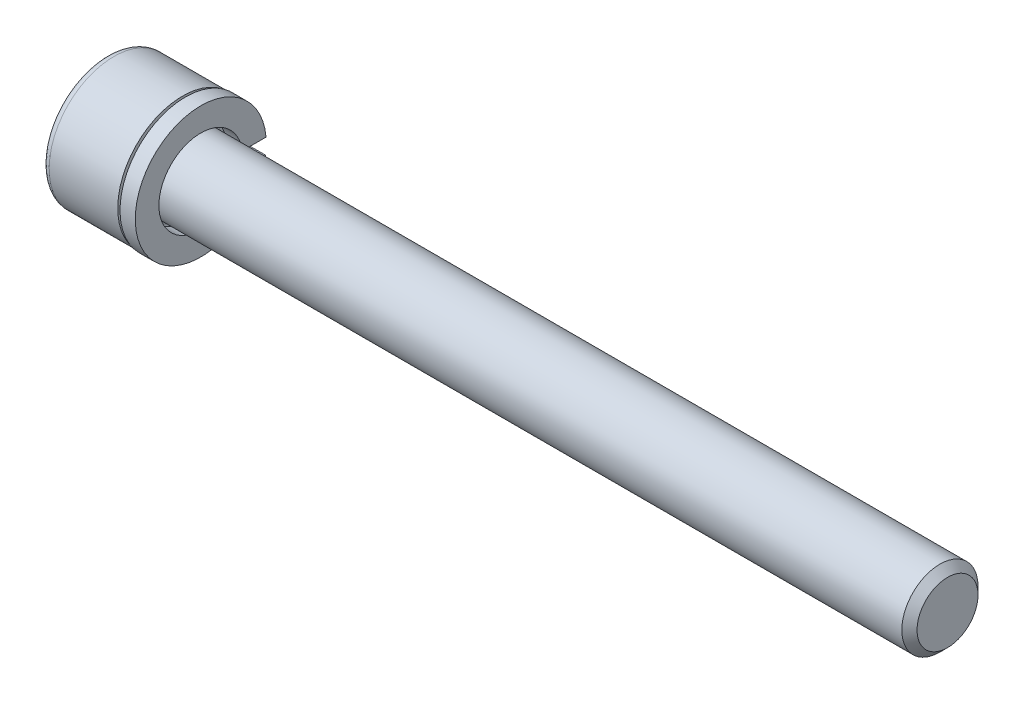
ISO-10303-21;
HEADER;
FILE_DESCRIPTION(('STEP AP214'),'2;1');
FILE_NAME('part.step','',(''),(''),'','','');
FILE_SCHEMA(('AUTOMOTIVE_DESIGN { 1 0 10303 214 1 1 1 1 }'));
ENDSEC;
DATA;
#1=APPLICATION_CONTEXT('core data for automotive mechanical design processes');
#2=APPLICATION_PROTOCOL_DEFINITION('international standard','automotive_design',2000,#1);
#3=PRODUCT_CONTEXT('',#1,'mechanical');
#4=PRODUCT('Part','Part','',(#3));
#5=PRODUCT_RELATED_PRODUCT_CATEGORY('part','',(#4));
#6=PRODUCT_DEFINITION_FORMATION('','',#4);
#7=PRODUCT_DEFINITION_CONTEXT('part definition',#1,'design');
#8=PRODUCT_DEFINITION('design','',#6,#7);
#9=PRODUCT_DEFINITION_SHAPE('','',#8);
#10=(LENGTH_UNIT() NAMED_UNIT(*) SI_UNIT(.MILLI.,.METRE.));
#11=(NAMED_UNIT(*) PLANE_ANGLE_UNIT() SI_UNIT($,.RADIAN.));
#12=(NAMED_UNIT(*) SI_UNIT($,.STERADIAN.) SOLID_ANGLE_UNIT());
#13=UNCERTAINTY_MEASURE_WITH_UNIT(LENGTH_MEASURE(1.E-05),#10,'distance_accuracy_value','');
#14=(GEOMETRIC_REPRESENTATION_CONTEXT(3) GLOBAL_UNCERTAINTY_ASSIGNED_CONTEXT((#13)) GLOBAL_UNIT_ASSIGNED_CONTEXT((#10,
#11,#12)) REPRESENTATION_CONTEXT('',''));
#15=CARTESIAN_POINT('',(0.,0.,0.));
#16=DIRECTION('',(0.,0.,1.));
#17=DIRECTION('',(1.,0.,0.));
#18=AXIS2_PLACEMENT_3D('',#15,#16,#17);
#19=CARTESIAN_POINT('',(-2.49999999994088,0.,0.));
#20=DIRECTION('',(-1.,0.,0.));
#21=DIRECTION('',(0.,-1.,0.));
#22=AXIS2_PLACEMENT_3D('',#19,#20,#21);
#23=CONICAL_SURFACE('',#22,2.2914999999557,1.04719755113381);
#24=CARTESIAN_POINT('',(-1.17700185805347,-1.70530256582424E-10,0.));
#25=VERTEX_POINT('',#24);
#26=VERTEX_LOOP('',#25);
#27=FACE_BOUND('',#26,.T.);
#28=CARTESIAN_POINT('',(-2.50000000000652,0.,0.));
#29=DIRECTION('',(-1.,0.,0.));
#30=DIRECTION('',(0.,-1.,0.));
#31=AXIS2_PLACEMENT_3D('',#28,#29,#30);
#32=CIRCLE('',#31,2.29150000006939);
#33=CARTESIAN_POINT('',(-2.50000000000652,-1.14575000003469,-1.98449721283214));
#34=VERTEX_POINT('',#33);
#35=CARTESIAN_POINT('',(-2.50000000000652,-2.29150000006939,0.));
#36=VERTEX_POINT('',#35);
#37=EDGE_CURVE('P0_E106',#34,#36,#32,.T.);
#38=ORIENTED_EDGE('',*,*,#37,.T.);
#39=CARTESIAN_POINT('',(-2.49999999994088,0.,0.));
#40=DIRECTION('',(-1.,0.,0.));
#41=DIRECTION('',(0.,-1.,0.));
#42=AXIS2_PLACEMENT_3D('',#39,#40,#41);
#43=CIRCLE('',#42,2.2914999999557);
#44=CARTESIAN_POINT('',(-2.49999999994088,-1.14574999997785,1.98449721273368));
#45=VERTEX_POINT('',#44);
#46=EDGE_CURVE('P0_E101',#36,#45,#43,.T.);
#47=ORIENTED_EDGE('',*,*,#46,.T.);
#48=CARTESIAN_POINT('',(-2.49999999994088,0.,0.));
#49=DIRECTION('',(-1.,0.,0.));
#50=DIRECTION('',(0.,-1.,0.));
#51=AXIS2_PLACEMENT_3D('',#48,#49,#50);
#52=CIRCLE('',#51,2.2914999999557);
#53=CARTESIAN_POINT('',(-2.49999999994088,1.14574999997785,1.98449721273368));
#54=VERTEX_POINT('',#53);
#55=EDGE_CURVE('P0_E103',#45,#54,#52,.T.);
#56=ORIENTED_EDGE('',*,*,#55,.T.);
#57=CARTESIAN_POINT('',(-2.49999999994088,0.,0.));
#58=DIRECTION('',(-1.,0.,0.));
#59=DIRECTION('',(0.,-1.,0.));
#60=AXIS2_PLACEMENT_3D('',#57,#58,#59);
#61=CIRCLE('',#60,2.2914999999557);
#62=CARTESIAN_POINT('',(-2.49999999998408,2.2915000000173,2.46963907657438E-11));
#63=VERTEX_POINT('',#62);
#64=EDGE_CURVE('P0_E117',#54,#63,#61,.T.);
#65=ORIENTED_EDGE('',*,*,#64,.T.);
#66=CARTESIAN_POINT('',(-2.49999999994088,0.,0.));
#67=DIRECTION('',(-1.,0.,0.));
#68=DIRECTION('',(0.,-1.,0.));
#69=AXIS2_PLACEMENT_3D('',#66,#67,#68);
#70=CIRCLE('',#69,2.2914999999557);
#71=CARTESIAN_POINT('',(-2.49999999994088,1.14574999997785,-1.98449721273368));
#72=VERTEX_POINT('',#71);
#73=EDGE_CURVE('P0_E200',#63,#72,#70,.T.);
#74=ORIENTED_EDGE('',*,*,#73,.T.);
#75=CARTESIAN_POINT('',(-2.49999999994088,0.,0.));
#76=DIRECTION('',(-1.,0.,0.));
#77=DIRECTION('',(0.,-1.,0.));
#78=AXIS2_PLACEMENT_3D('',#75,#76,#77);
#79=CIRCLE('',#78,2.2914999999557);
#80=EDGE_CURVE('P0_E198',#72,#34,#79,.T.);
#81=ORIENTED_EDGE('',*,*,#80,.T.);
#82=EDGE_LOOP('',(#38,#47,#56,#65,#74,#81));
#83=FACE_BOUND('',#82,.T.);
#84=ADVANCED_FACE('P0_F37',(#27,#83),#23,.F.);
#85=CARTESIAN_POINT('',(-2.5,0.,0.));
#86=DIRECTION('',(-1.,0.,0.));
#87=DIRECTION('',(0.,-1.,0.));
#88=AXIS2_PLACEMENT_3D('',#85,#86,#87);
#89=PLANE('',#88);
#90=ORIENTED_EDGE('',*,*,#55,.F.);
#91=DIRECTION('',(0.,-1.,0.));
#92=VECTOR('',#91,1.);
#93=CARTESIAN_POINT('',(-2.5,-1.14575,1.98449721277204));
#94=LINE('',#93,#92);
#95=EDGE_CURVE('P0_E111',#45,#54,#94,.F.);
#96=ORIENTED_EDGE('',*,*,#95,.T.);
#97=EDGE_LOOP('',(#90,#96));
#98=FACE_BOUND('',#97,.T.);
#99=ADVANCED_FACE('P0_F114',(#98),#89,.F.);
#100=CARTESIAN_POINT('',(-2.5,0.,0.));
#101=DIRECTION('',(-1.,0.,0.));
#102=DIRECTION('',(0.,-1.,0.));
#103=AXIS2_PLACEMENT_3D('',#100,#101,#102);
#104=PLANE('',#103);
#105=ORIENTED_EDGE('',*,*,#64,.F.);
#106=DIRECTION('',(0.,-0.5,0.866025403784439));
#107=VECTOR('',#106,1.);
#108=CARTESIAN_POINT('',(-2.5,1.14575,1.98449721277204));
#109=LINE('',#108,#107);
#110=EDGE_CURVE('P0_E180',#54,#63,#109,.F.);
#111=ORIENTED_EDGE('',*,*,#110,.T.);
#112=EDGE_LOOP('',(#105,#111));
#113=FACE_BOUND('',#112,.T.);
#114=ADVANCED_FACE('P0_F341',(#113),#104,.F.);
#115=CARTESIAN_POINT('',(-2.5,0.,0.));
#116=DIRECTION('',(-1.,0.,0.));
#117=DIRECTION('',(0.,-1.,0.));
#118=AXIS2_PLACEMENT_3D('',#115,#116,#117);
#119=PLANE('',#118);
#120=ORIENTED_EDGE('',*,*,#73,.F.);
#121=DIRECTION('',(0.,0.5,0.866025403784439));
#122=VECTOR('',#121,1.);
#123=CARTESIAN_POINT('',(-2.5,2.2915,0.));
#124=LINE('',#123,#122);
#125=EDGE_CURVE('P0_E169',#63,#72,#124,.F.);
#126=ORIENTED_EDGE('',*,*,#125,.T.);
#127=EDGE_LOOP('',(#120,#126));
#128=FACE_BOUND('',#127,.T.);
#129=ADVANCED_FACE('P0_F349',(#128),#119,.F.);
#130=CARTESIAN_POINT('',(-2.5,0.,0.));
#131=DIRECTION('',(-1.,0.,0.));
#132=DIRECTION('',(0.,-1.,0.));
#133=AXIS2_PLACEMENT_3D('',#130,#131,#132);
#134=PLANE('',#133);
#135=ORIENTED_EDGE('',*,*,#80,.F.);
#136=DIRECTION('',(0.,1.,0.));
#137=VECTOR('',#136,1.);
#138=CARTESIAN_POINT('',(-2.5,1.14575,-1.98449721277205));
#139=LINE('',#138,#137);
#140=EDGE_CURVE('P0_E157',#72,#34,#139,.F.);
#141=ORIENTED_EDGE('',*,*,#140,.T.);
#142=EDGE_LOOP('',(#135,#141));
#143=FACE_BOUND('',#142,.T.);
#144=ADVANCED_FACE('P0_F358',(#143),#134,.F.);
#145=CARTESIAN_POINT('',(-2.5,0.,0.));
#146=DIRECTION('',(-1.,0.,0.));
#147=DIRECTION('',(0.,-1.,0.));
#148=AXIS2_PLACEMENT_3D('',#145,#146,#147);
#149=PLANE('',#148);
#150=ORIENTED_EDGE('',*,*,#37,.F.);
#151=DIRECTION('',(0.,0.5,-0.866025403784438));
#152=VECTOR('',#151,1.);
#153=CARTESIAN_POINT('',(-2.5,-1.14575,-1.98449721277204));
#154=LINE('',#153,#152);
#155=EDGE_CURVE('P0_E143',#34,#36,#154,.F.);
#156=ORIENTED_EDGE('',*,*,#155,.T.);
#157=EDGE_LOOP('',(#150,#156));
#158=FACE_BOUND('',#157,.T.);
#159=ADVANCED_FACE('P0_F430',(#158),#149,.F.);
#160=CARTESIAN_POINT('',(-2.5,0.,0.));
#161=DIRECTION('',(-1.,0.,0.));
#162=DIRECTION('',(0.,-1.,0.));
#163=AXIS2_PLACEMENT_3D('',#160,#161,#162);
#164=PLANE('',#163);
#165=ORIENTED_EDGE('',*,*,#46,.F.);
#166=DIRECTION('',(0.,-0.5,-0.866025403784438));
#167=VECTOR('',#166,1.);
#168=CARTESIAN_POINT('',(-2.5,-2.2915,0.));
#169=LINE('',#168,#167);
#170=EDGE_CURVE('P0_E119',#36,#45,#169,.F.);
#171=ORIENTED_EDGE('',*,*,#170,.T.);
#172=EDGE_LOOP('',(#165,#171));
#173=FACE_BOUND('',#172,.T.);
#174=ADVANCED_FACE('P0_F120',(#173),#164,.F.);
#175=CARTESIAN_POINT('',(-2.5,-1.14575,1.98449721277204));
#176=DIRECTION('',(0.,0.,1.));
#177=DIRECTION('',(0.,-1.,0.));
#178=AXIS2_PLACEMENT_3D('',#175,#176,#177);
#179=PLANE('',#178);
#180=DIRECTION('',(1.,0.,0.));
#181=VECTOR('',#180,1.);
#182=CARTESIAN_POINT('',(-2.5,1.14575,1.98449721277204));
#183=LINE('',#182,#181);
#184=CARTESIAN_POINT('',(-5.,1.14575,1.98449721277204));
#185=VERTEX_POINT('',#184);
#186=EDGE_CURVE('P0_E131',#185,#54,#183,.T.);
#187=ORIENTED_EDGE('',*,*,#186,.T.);
#188=ORIENTED_EDGE('',*,*,#95,.F.);
#189=DIRECTION('',(1.,0.,0.));
#190=VECTOR('',#189,1.);
#191=CARTESIAN_POINT('',(-2.5,-1.14575,1.98449721277204));
#192=LINE('',#191,#190);
#193=CARTESIAN_POINT('',(-5.,-1.14575,1.98449721277204));
#194=VERTEX_POINT('',#193);
#195=EDGE_CURVE('P0_E124',#45,#194,#192,.F.);
#196=ORIENTED_EDGE('',*,*,#195,.T.);
#197=DIRECTION('',(0.,1.,0.));
#198=VECTOR('',#197,1.);
#199=CARTESIAN_POINT('',(-5.,2.2915,1.98449721277204));
#200=LINE('',#199,#198);
#201=EDGE_CURVE('P0_E138',#194,#185,#200,.T.);
#202=ORIENTED_EDGE('',*,*,#201,.T.);
#203=EDGE_LOOP('',(#187,#188,#196,#202));
#204=FACE_BOUND('',#203,.T.);
#205=ADVANCED_FACE('P0_F128',(#204),#179,.F.);
#206=CARTESIAN_POINT('',(-2.5,1.14575,1.98449721277204));
#207=DIRECTION('',(0.,0.866025403784439,0.5));
#208=DIRECTION('',(0.,-0.5,0.866025403784439));
#209=AXIS2_PLACEMENT_3D('',#206,#207,#208);
#210=PLANE('',#209);
#211=DIRECTION('',(1.,0.,0.));
#212=VECTOR('',#211,1.);
#213=CARTESIAN_POINT('',(-2.5,2.2915,0.));
#214=LINE('',#213,#212);
#215=CARTESIAN_POINT('',(-5.,2.2915,0.));
#216=VERTEX_POINT('',#215);
#217=EDGE_CURVE('P0_E174',#216,#63,#214,.T.);
#218=ORIENTED_EDGE('',*,*,#217,.T.);
#219=ORIENTED_EDGE('',*,*,#110,.F.);
#220=ORIENTED_EDGE('',*,*,#186,.F.);
#221=DIRECTION('',(0.,0.500000000000001,-0.866025403784438));
#222=VECTOR('',#221,1.);
#223=CARTESIAN_POINT('',(-5.,1.14575,1.98449721277204));
#224=LINE('',#223,#222);
#225=EDGE_CURVE('P0_E140',#185,#216,#224,.T.);
#226=ORIENTED_EDGE('',*,*,#225,.T.);
#227=EDGE_LOOP('',(#218,#219,#220,#226));
#228=FACE_BOUND('',#227,.T.);
#229=ADVANCED_FACE('P0_F367',(#228),#210,.F.);
#230=CARTESIAN_POINT('',(-2.5,2.2915,0.));
#231=DIRECTION('',(0.,0.866025403784439,-0.5));
#232=DIRECTION('',(0.,0.5,0.866025403784439));
#233=AXIS2_PLACEMENT_3D('',#230,#231,#232);
#234=PLANE('',#233);
#235=DIRECTION('',(1.,0.,0.));
#236=VECTOR('',#235,1.);
#237=CARTESIAN_POINT('',(-2.5,1.14575,-1.98449721277205));
#238=LINE('',#237,#236);
#239=CARTESIAN_POINT('',(-5.,1.14575,-1.98449721277204));
#240=VERTEX_POINT('',#239);
#241=EDGE_CURVE('P0_E162',#240,#72,#238,.T.);
#242=ORIENTED_EDGE('',*,*,#241,.T.);
#243=ORIENTED_EDGE('',*,*,#125,.F.);
#244=ORIENTED_EDGE('',*,*,#217,.F.);
#245=DIRECTION('',(0.,-0.5,-0.866025403784439));
#246=VECTOR('',#245,1.);
#247=CARTESIAN_POINT('',(-5.,2.2915,0.));
#248=LINE('',#247,#246);
#249=EDGE_CURVE('P0_E164',#216,#240,#248,.T.);
#250=ORIENTED_EDGE('',*,*,#249,.T.);
#251=EDGE_LOOP('',(#242,#243,#244,#250));
#252=FACE_BOUND('',#251,.T.);
#253=ADVANCED_FACE('P0_F375',(#252),#234,.F.);
#254=CARTESIAN_POINT('',(-2.5,1.14575,-1.98449721277205));
#255=DIRECTION('',(0.,0.,-1.));
#256=DIRECTION('',(0.,1.,0.));
#257=AXIS2_PLACEMENT_3D('',#254,#255,#256);
#258=PLANE('',#257);
#259=DIRECTION('',(1.,0.,0.));
#260=VECTOR('',#259,1.);
#261=CARTESIAN_POINT('',(-2.5,-1.14575,-1.98449721277204));
#262=LINE('',#261,#260);
#263=CARTESIAN_POINT('',(-5.,-1.14575,-1.98449721277204));
#264=VERTEX_POINT('',#263);
#265=EDGE_CURVE('P0_E145',#264,#34,#262,.T.);
#266=ORIENTED_EDGE('',*,*,#265,.T.);
#267=ORIENTED_EDGE('',*,*,#140,.F.);
#268=ORIENTED_EDGE('',*,*,#241,.F.);
#269=DIRECTION('',(0.,1.,0.));
#270=VECTOR('',#269,1.);
#271=CARTESIAN_POINT('',(-5.,2.2915,-1.98449721277204));
#272=LINE('',#271,#270);
#273=EDGE_CURVE('P0_E148',#240,#264,#272,.F.);
#274=ORIENTED_EDGE('',*,*,#273,.T.);
#275=EDGE_LOOP('',(#266,#267,#268,#274));
#276=FACE_BOUND('',#275,.T.);
#277=ADVANCED_FACE('P0_F384',(#276),#258,.F.);
#278=CARTESIAN_POINT('',(-2.5,-1.14575,-1.98449721277204));
#279=DIRECTION('',(0.,-0.866025403784438,-0.5));
#280=DIRECTION('',(0.,0.5,-0.866025403784438));
#281=AXIS2_PLACEMENT_3D('',#278,#279,#280);
#282=PLANE('',#281);
#283=DIRECTION('',(1.,0.,0.));
#284=VECTOR('',#283,1.);
#285=CARTESIAN_POINT('',(-2.5,-2.2915,0.));
#286=LINE('',#285,#284);
#287=CARTESIAN_POINT('',(-5.,-2.2915,0.));
#288=VERTEX_POINT('',#287);
#289=EDGE_CURVE('P0_E125',#288,#36,#286,.T.);
#290=ORIENTED_EDGE('',*,*,#289,.T.);
#291=ORIENTED_EDGE('',*,*,#155,.F.);
#292=ORIENTED_EDGE('',*,*,#265,.F.);
#293=DIRECTION('',(0.,-0.5,0.866025403784439));
#294=VECTOR('',#293,1.);
#295=CARTESIAN_POINT('',(-5.,-1.14575,-1.98449721277204));
#296=LINE('',#295,#294);
#297=EDGE_CURVE('P0_E146',#264,#288,#296,.T.);
#298=ORIENTED_EDGE('',*,*,#297,.T.);
#299=EDGE_LOOP('',(#290,#291,#292,#298));
#300=FACE_BOUND('',#299,.T.);
#301=ADVANCED_FACE('P0_F393',(#300),#282,.F.);
#302=CARTESIAN_POINT('',(-2.5,-2.2915,0.));
#303=DIRECTION('',(0.,-0.866025403784438,0.5));
#304=DIRECTION('',(0.,-0.5,-0.866025403784438));
#305=AXIS2_PLACEMENT_3D('',#302,#303,#304);
#306=PLANE('',#305);
#307=ORIENTED_EDGE('',*,*,#195,.F.);
#308=ORIENTED_EDGE('',*,*,#170,.F.);
#309=ORIENTED_EDGE('',*,*,#289,.F.);
#310=DIRECTION('',(0.,0.5,0.866025403784439));
#311=VECTOR('',#310,1.);
#312=CARTESIAN_POINT('',(-5.,-2.2915,0.));
#313=LINE('',#312,#311);
#314=EDGE_CURVE('P0_E136',#288,#194,#313,.T.);
#315=ORIENTED_EDGE('',*,*,#314,.T.);
#316=EDGE_LOOP('',(#307,#308,#309,#315));
#317=FACE_BOUND('',#316,.T.);
#318=ADVANCED_FACE('P0_F134',(#317),#306,.F.);
#319=CARTESIAN_POINT('',(-5.,2.2915,0.));
#320=DIRECTION('',(1.,0.,0.));
#321=DIRECTION('',(0.,1.,0.));
#322=AXIS2_PLACEMENT_3D('',#319,#320,#321);
#323=PLANE('',#322);
#324=CARTESIAN_POINT('',(-5.,0.,0.));
#325=DIRECTION('',(1.,0.,0.));
#326=DIRECTION('',(0.,-1.,0.));
#327=AXIS2_PLACEMENT_3D('',#324,#325,#326);
#328=CIRCLE('',#327,3.75);
#329=CARTESIAN_POINT('',(-5.,-3.75,0.));
#330=VERTEX_POINT('',#329);
#331=CARTESIAN_POINT('',(-5.,3.75,0.));
#332=VERTEX_POINT('',#331);
#333=EDGE_CURVE('P0_E152',#330,#332,#328,.T.);
#334=ORIENTED_EDGE('',*,*,#333,.F.);
#335=CARTESIAN_POINT('',(-5.,0.,0.));
#336=DIRECTION('',(1.,0.,0.));
#337=DIRECTION('',(0.,1.,0.));
#338=AXIS2_PLACEMENT_3D('',#335,#336,#337);
#339=CIRCLE('',#338,3.75);
#340=EDGE_CURVE('P0_E262',#332,#330,#339,.T.);
#341=ORIENTED_EDGE('',*,*,#340,.F.);
#342=EDGE_LOOP('',(#334,#341));
#343=FACE_BOUND('',#342,.T.);
#344=ORIENTED_EDGE('',*,*,#297,.F.);
#345=ORIENTED_EDGE('',*,*,#273,.F.);
#346=ORIENTED_EDGE('',*,*,#249,.F.);
#347=ORIENTED_EDGE('',*,*,#225,.F.);
#348=ORIENTED_EDGE('',*,*,#201,.F.);
#349=ORIENTED_EDGE('',*,*,#314,.F.);
#350=EDGE_LOOP('',(#344,#345,#346,#347,#348,#349));
#351=FACE_BOUND('',#350,.T.);
#352=ADVANCED_FACE('P0_F272',(#343,#351),#323,.F.);
#353=CARTESIAN_POINT('',(-4.5,0.,0.));
#354=DIRECTION('',(-1.,0.,0.));
#355=DIRECTION('',(0.,1.,0.));
#356=AXIS2_PLACEMENT_3D('',#353,#354,#355);
#357=TOROIDAL_SURFACE('',#356,3.75,0.5);
#358=ORIENTED_EDGE('',*,*,#333,.T.);
#359=ORIENTED_EDGE('',*,*,#340,.T.);
#360=EDGE_LOOP('',(#358,#359));
#361=FACE_BOUND('',#360,.T.);
#362=CARTESIAN_POINT('',(-4.5,0.,0.));
#363=DIRECTION('',(-1.,0.,0.));
#364=DIRECTION('',(0.,-1.,0.));
#365=AXIS2_PLACEMENT_3D('',#362,#363,#364);
#366=CIRCLE('',#365,4.25);
#367=CARTESIAN_POINT('',(-4.5,-4.25,0.));
#368=VERTEX_POINT('',#367);
#369=EDGE_CURVE('P0_E195',#368,#368,#366,.F.);
#370=ORIENTED_EDGE('',*,*,#369,.F.);
#371=EDGE_LOOP('',(#370));
#372=FACE_BOUND('',#371,.T.);
#373=ADVANCED_FACE('P0_F267',(#361,#372),#357,.T.);
#374=CARTESIAN_POINT('',(-1.17700185815197,0.,0.));
#375=DIRECTION('',(-1.,0.,0.));
#376=DIRECTION('',(0.,-1.,0.));
#377=AXIS2_PLACEMENT_3D('',#374,#375,#376);
#378=CYLINDRICAL_SURFACE('',#377,4.25);
#379=ORIENTED_EDGE('',*,*,#369,.T.);
#380=EDGE_LOOP('',(#379));
#381=FACE_BOUND('',#380,.T.);
#382=CARTESIAN_POINT('',(0.,0.,0.));
#383=DIRECTION('',(-1.,0.,0.));
#384=DIRECTION('',(0.,-1.,0.));
#385=AXIS2_PLACEMENT_3D('',#382,#383,#384);
#386=CIRCLE('',#385,4.25);
#387=CARTESIAN_POINT('',(0.,-4.25,0.));
#388=VERTEX_POINT('',#387);
#389=EDGE_CURVE('P0_E193',#388,#388,#386,.T.);
#390=ORIENTED_EDGE('',*,*,#389,.T.);
#391=EDGE_LOOP('',(#390));
#392=FACE_BOUND('',#391,.T.);
#393=ADVANCED_FACE('P0_F271',(#381,#392),#378,.T.);
#394=CARTESIAN_POINT('',(0.,4.25,0.));
#395=DIRECTION('',(-1.,0.,0.));
#396=DIRECTION('',(0.,-1.,0.));
#397=AXIS2_PLACEMENT_3D('',#394,#395,#396);
#398=PLANE('',#397);
#399=CARTESIAN_POINT('',(0.,0.,0.));
#400=DIRECTION('',(1.,0.,0.));
#401=DIRECTION('',(0.,-1.,0.));
#402=AXIS2_PLACEMENT_3D('',#399,#400,#401);
#403=CIRCLE('',#402,2.7);
#404=CARTESIAN_POINT('',(0.,2.7,0.));
#405=VERTEX_POINT('',#404);
#406=CARTESIAN_POINT('',(0.,-2.7,0.));
#407=VERTEX_POINT('',#406);
#408=EDGE_CURVE('P0_E232',#405,#407,#403,.F.);
#409=ORIENTED_EDGE('',*,*,#408,.T.);
#410=CARTESIAN_POINT('',(0.,0.,0.));
#411=DIRECTION('',(1.,0.,0.));
#412=DIRECTION('',(0.,1.,0.));
#413=AXIS2_PLACEMENT_3D('',#410,#411,#412);
#414=CIRCLE('',#413,2.7);
#415=EDGE_CURVE('P0_E53',#407,#405,#414,.F.);
#416=ORIENTED_EDGE('',*,*,#415,.T.);
#417=EDGE_LOOP('',(#409,#416));
#418=FACE_BOUND('',#417,.T.);
#419=ORIENTED_EDGE('',*,*,#389,.F.);
#420=EDGE_LOOP('',(#419));
#421=FACE_BOUND('',#420,.T.);
#422=ADVANCED_FACE('P0_F222',(#418,#421),#398,.F.);
#423=CARTESIAN_POINT('',(0.200000000000003,0.,0.));
#424=DIRECTION('',(-1.,0.,0.));
#425=DIRECTION('',(0.,1.,0.));
#426=AXIS2_PLACEMENT_3D('',#423,#424,#425);
#427=TOROIDAL_SURFACE('',#426,2.7,0.2);
#428=CARTESIAN_POINT('',(0.200000000000002,0.,0.));
#429=DIRECTION('',(-1.,0.,0.));
#430=DIRECTION('',(0.,-1.,0.));
#431=AXIS2_PLACEMENT_3D('',#428,#429,#430);
#432=CIRCLE('',#431,2.5);
#433=CARTESIAN_POINT('',(0.200000000000002,-2.5,0.));
#434=VERTEX_POINT('',#433);
#435=EDGE_CURVE('P0_E252',#434,#434,#432,.F.);
#436=ORIENTED_EDGE('',*,*,#435,.F.);
#437=EDGE_LOOP('',(#436));
#438=FACE_BOUND('',#437,.T.);
#439=ORIENTED_EDGE('',*,*,#408,.F.);
#440=ORIENTED_EDGE('',*,*,#415,.F.);
#441=EDGE_LOOP('',(#439,#440));
#442=FACE_BOUND('',#441,.T.);
#443=ADVANCED_FACE('P0_F210',(#438,#442),#427,.F.);
#444=CARTESIAN_POINT('',(-1.17700185815197,0.,0.));
#445=DIRECTION('',(-1.,0.,0.));
#446=DIRECTION('',(0.,-1.,0.));
#447=AXIS2_PLACEMENT_3D('',#444,#445,#446);
#448=CYLINDRICAL_SURFACE('',#447,2.5);
#449=CARTESIAN_POINT('',(49.7,0.,0.));
#450=DIRECTION('',(1.,0.,0.));
#451=DIRECTION('',(0.,1.,0.));
#452=AXIS2_PLACEMENT_3D('',#449,#450,#451);
#453=CIRCLE('',#452,2.5);
#454=CARTESIAN_POINT('',(49.7,2.5,0.));
#455=VERTEX_POINT('',#454);
#456=EDGE_CURVE('P0_E11',#455,#455,#453,.F.);
#457=ORIENTED_EDGE('',*,*,#456,.T.);
#458=EDGE_LOOP('',(#457));
#459=FACE_BOUND('',#458,.T.);
#460=ORIENTED_EDGE('',*,*,#435,.T.);
#461=EDGE_LOOP('',(#460));
#462=FACE_BOUND('',#461,.T.);
#463=ADVANCED_FACE('P0_F221',(#459,#462),#448,.T.);
#464=CARTESIAN_POINT('',(50.2,0.,0.));
#465=DIRECTION('',(1.,0.,0.));
#466=DIRECTION('',(0.,0.,-1.));
#467=AXIS2_PLACEMENT_3D('',#464,#465,#466);
#468=PLANE('',#467);
#469=CARTESIAN_POINT('',(50.2,0.,0.));
#470=DIRECTION('',(1.,0.,0.));
#471=DIRECTION('',(0.,0.,-1.));
#472=AXIS2_PLACEMENT_3D('',#469,#470,#471);
#473=CIRCLE('',#472,1.99999999999999);
#474=CARTESIAN_POINT('',(50.2,0.,-1.99999999999999));
#475=VERTEX_POINT('',#474);
#476=EDGE_CURVE('P0_E46',#475,#475,#473,.T.);
#477=ORIENTED_EDGE('',*,*,#476,.T.);
#478=EDGE_LOOP('',(#477));
#479=FACE_BOUND('',#478,.T.);
#480=ADVANCED_FACE('P0_F292',(#479),#468,.T.);
#481=CARTESIAN_POINT('',(50.2,0.,0.));
#482=DIRECTION('',(-1.,0.,0.));
#483=DIRECTION('',(0.,-1.,0.));
#484=AXIS2_PLACEMENT_3D('',#481,#482,#483);
#485=CONICAL_SURFACE('',#484,1.99999999999999,0.785398163397446);
#486=ORIENTED_EDGE('',*,*,#456,.F.);
#487=EDGE_LOOP('',(#486));
#488=FACE_BOUND('',#487,.T.);
#489=ORIENTED_EDGE('',*,*,#476,.F.);
#490=EDGE_LOOP('',(#489));
#491=FACE_BOUND('',#490,.T.);
#492=ADVANCED_FACE('P0_F39',(#488,#491),#485,.T.);
#493=CLOSED_SHELL('',(#84,#99,#114,#129,#144,#159,#174,#205,#229,#253,#277,#301,#318,#352,#373,
#393,#422,#443,#463,#480,#492));
#494=MANIFOLD_SOLID_BREP('P0_B2',#493);
#495=CARTESIAN_POINT('',(1.2,0.,0.));
#496=DIRECTION('',(1.,0.,0.));
#497=DIRECTION('',(0.,1.,0.));
#498=AXIS2_PLACEMENT_3D('',#495,#496,#497);
#499=PLANE('',#498);
#500=CARTESIAN_POINT('',(1.2,0.,0.));
#501=DIRECTION('',(-1.,0.,0.));
#502=DIRECTION('',(0.,-1.,0.));
#503=AXIS2_PLACEMENT_3D('',#500,#501,#502);
#504=CIRCLE('',#503,2.75);
#505=CARTESIAN_POINT('',(1.2,-0.63593269228035,-2.67546063527182));
#506=VERTEX_POINT('',#505);
#507=CARTESIAN_POINT('',(1.2,0.374431043820241,-2.72439009567714));
#508=VERTEX_POINT('',#507);
#509=EDGE_CURVE('P1_E19',#506,#508,#504,.T.);
#510=ORIENTED_EDGE('',*,*,#509,.T.);
#511=DIRECTION('',(0.,0.,1.));
#512=VECTOR('',#511,1.);
#513=CARTESIAN_POINT('',(1.2,0.374431043820241,-2.72439009567714));
#514=LINE('',#513,#512);
#515=CARTESIAN_POINT('',(1.2,0.374431043820242,-4.28366681634131));
#516=VERTEX_POINT('',#515);
#517=EDGE_CURVE('P1_E62',#508,#516,#514,.F.);
#518=ORIENTED_EDGE('',*,*,#517,.T.);
#519=CARTESIAN_POINT('',(1.2,0.,0.));
#520=DIRECTION('',(-1.,0.,0.));
#521=DIRECTION('',(0.,-1.,0.));
#522=AXIS2_PLACEMENT_3D('',#519,#520,#521);
#523=CIRCLE('',#522,4.3);
#524=CARTESIAN_POINT('',(1.2,-0.63593269228035,-4.25271555725152));
#525=VERTEX_POINT('',#524);
#526=EDGE_CURVE('P1_E57',#525,#516,#523,.T.);
#527=ORIENTED_EDGE('',*,*,#526,.F.);
#528=DIRECTION('',(0.,0.,1.));
#529=VECTOR('',#528,1.);
#530=CARTESIAN_POINT('',(1.2,-0.63593269228035,-2.67546063527182));
#531=LINE('',#530,#529);
#532=EDGE_CURVE('P1_E59',#525,#506,#531,.T.);
#533=ORIENTED_EDGE('',*,*,#532,.T.);
#534=EDGE_LOOP('',(#510,#518,#527,#533));
#535=FACE_BOUND('',#534,.T.);
#536=ADVANCED_FACE('P1_F16',(#535),#499,.T.);
#537=CARTESIAN_POINT('',(1.2,-0.63593269228035,-2.67546063527182));
#538=DIRECTION('',(0.,-1.,0.));
#539=DIRECTION('',(1.,0.,0.));
#540=AXIS2_PLACEMENT_3D('',#537,#538,#539);
#541=PLANE('',#540);
#542=DIRECTION('',(-1.,0.,0.));
#543=VECTOR('',#542,1.);
#544=CARTESIAN_POINT('',(1.2,-0.63593269228035,-2.67546063527182));
#545=LINE('',#544,#543);
#546=CARTESIAN_POINT('',(0.2,-0.63593269228035,-2.67546063527182));
#547=VERTEX_POINT('',#546);
#548=EDGE_CURVE('P1_E72',#547,#506,#545,.F.);
#549=ORIENTED_EDGE('',*,*,#548,.T.);
#550=ORIENTED_EDGE('',*,*,#532,.F.);
#551=DIRECTION('',(1.,0.,0.));
#552=VECTOR('',#551,1.);
#553=CARTESIAN_POINT('',(1.2,-0.63593269228035,-4.25271555725152));
#554=LINE('',#553,#552);
#555=CARTESIAN_POINT('',(0.2,-0.63593269228035,-4.25271555725152));
#556=VERTEX_POINT('',#555);
#557=EDGE_CURVE('P1_E71',#556,#525,#554,.T.);
#558=ORIENTED_EDGE('',*,*,#557,.F.);
#559=DIRECTION('',(0.,0.,1.));
#560=VECTOR('',#559,1.);
#561=CARTESIAN_POINT('',(0.2,-0.63593269228035,0.));
#562=LINE('',#561,#560);
#563=EDGE_CURVE('P1_E82',#556,#547,#562,.T.);
#564=ORIENTED_EDGE('',*,*,#563,.T.);
#565=EDGE_LOOP('',(#549,#550,#558,#564));
#566=FACE_BOUND('',#565,.T.);
#567=ADVANCED_FACE('P1_F69',(#566),#541,.F.);
#568=CARTESIAN_POINT('',(1.2,0.,0.));
#569=DIRECTION('',(-1.,0.,0.));
#570=DIRECTION('',(0.,-1.,0.));
#571=AXIS2_PLACEMENT_3D('',#568,#569,#570);
#572=CYLINDRICAL_SURFACE('',#571,2.75);
#573=ORIENTED_EDGE('',*,*,#509,.F.);
#574=ORIENTED_EDGE('',*,*,#548,.F.);
#575=CARTESIAN_POINT('',(0.2,0.,0.));
#576=DIRECTION('',(-1.,0.,0.));
#577=DIRECTION('',(0.,-1.,0.));
#578=AXIS2_PLACEMENT_3D('',#575,#576,#577);
#579=CIRCLE('',#578,2.75);
#580=CARTESIAN_POINT('',(0.2,0.374431043820241,-2.72439009567714));
#581=VERTEX_POINT('',#580);
#582=EDGE_CURVE('P1_E25',#547,#581,#579,.T.);
#583=ORIENTED_EDGE('',*,*,#582,.T.);
#584=DIRECTION('',(-1.,0.,0.));
#585=VECTOR('',#584,1.);
#586=CARTESIAN_POINT('',(1.2,0.374431043820241,-2.72439009567714));
#587=LINE('',#586,#585);
#588=EDGE_CURVE('P1_E79',#581,#508,#587,.F.);
#589=ORIENTED_EDGE('',*,*,#588,.T.);
#590=EDGE_LOOP('',(#573,#574,#583,#589));
#591=FACE_BOUND('',#590,.T.);
#592=ADVANCED_FACE('P1_F90',(#591),#572,.F.);
#593=CARTESIAN_POINT('',(1.2,0.374431043820241,-2.72439009567714));
#594=DIRECTION('',(0.,1.,0.));
#595=DIRECTION('',(-1.,0.,0.));
#596=AXIS2_PLACEMENT_3D('',#593,#594,#595);
#597=PLANE('',#596);
#598=DIRECTION('',(-1.,0.,0.));
#599=VECTOR('',#598,1.);
#600=CARTESIAN_POINT('',(1.2,0.374431043820242,-4.28366681634131));
#601=LINE('',#600,#599);
#602=CARTESIAN_POINT('',(0.2,0.374431043820241,-4.28366681634131));
#603=VERTEX_POINT('',#602);
#604=EDGE_CURVE('P1_E66',#516,#603,#601,.T.);
#605=ORIENTED_EDGE('',*,*,#604,.F.);
#606=ORIENTED_EDGE('',*,*,#517,.F.);
#607=ORIENTED_EDGE('',*,*,#588,.F.);
#608=DIRECTION('',(0.,0.,1.));
#609=VECTOR('',#608,1.);
#610=CARTESIAN_POINT('',(0.2,0.37443104382024,0.));
#611=LINE('',#610,#609);
#612=EDGE_CURVE('P1_E11',#581,#603,#611,.F.);
#613=ORIENTED_EDGE('',*,*,#612,.T.);
#614=EDGE_LOOP('',(#605,#606,#607,#613));
#615=FACE_BOUND('',#614,.T.);
#616=ADVANCED_FACE('P1_F87',(#615),#597,.F.);
#617=CARTESIAN_POINT('',(1.2,0.,0.));
#618=DIRECTION('',(-1.,0.,0.));
#619=DIRECTION('',(0.,-1.,0.));
#620=AXIS2_PLACEMENT_3D('',#617,#618,#619);
#621=CYLINDRICAL_SURFACE('',#620,4.3);
#622=ORIENTED_EDGE('',*,*,#604,.T.);
#623=CARTESIAN_POINT('',(0.2,0.,0.));
#624=DIRECTION('',(-1.,0.,0.));
#625=DIRECTION('',(0.,-1.,0.));
#626=AXIS2_PLACEMENT_3D('',#623,#624,#625);
#627=CIRCLE('',#626,4.3);
#628=EDGE_CURVE('P1_E34',#603,#556,#627,.F.);
#629=ORIENTED_EDGE('',*,*,#628,.T.);
#630=ORIENTED_EDGE('',*,*,#557,.T.);
#631=ORIENTED_EDGE('',*,*,#526,.T.);
#632=EDGE_LOOP('',(#622,#629,#630,#631));
#633=FACE_BOUND('',#632,.T.);
#634=ADVANCED_FACE('P1_F74',(#633),#621,.T.);
#635=CARTESIAN_POINT('',(0.2,0.,0.));
#636=DIRECTION('',(1.,0.,0.));
#637=DIRECTION('',(0.,1.,0.));
#638=AXIS2_PLACEMENT_3D('',#635,#636,#637);
#639=PLANE('',#638);
#640=ORIENTED_EDGE('',*,*,#612,.F.);
#641=ORIENTED_EDGE('',*,*,#582,.F.);
#642=ORIENTED_EDGE('',*,*,#563,.F.);
#643=ORIENTED_EDGE('',*,*,#628,.F.);
#644=EDGE_LOOP('',(#640,#641,#642,#643));
#645=FACE_BOUND('',#644,.T.);
#646=ADVANCED_FACE('P1_F89',(#645),#639,.F.);
#647=CLOSED_SHELL('',(#536,#567,#592,#616,#634,#646));
#648=MANIFOLD_SOLID_BREP('P1_B1',#647);
#649=ADVANCED_BREP_SHAPE_REPRESENTATION('',(#18,#494,#648),#14);
#650=SHAPE_DEFINITION_REPRESENTATION(#9,#649);
ENDSEC;
END-ISO-10303-21;
